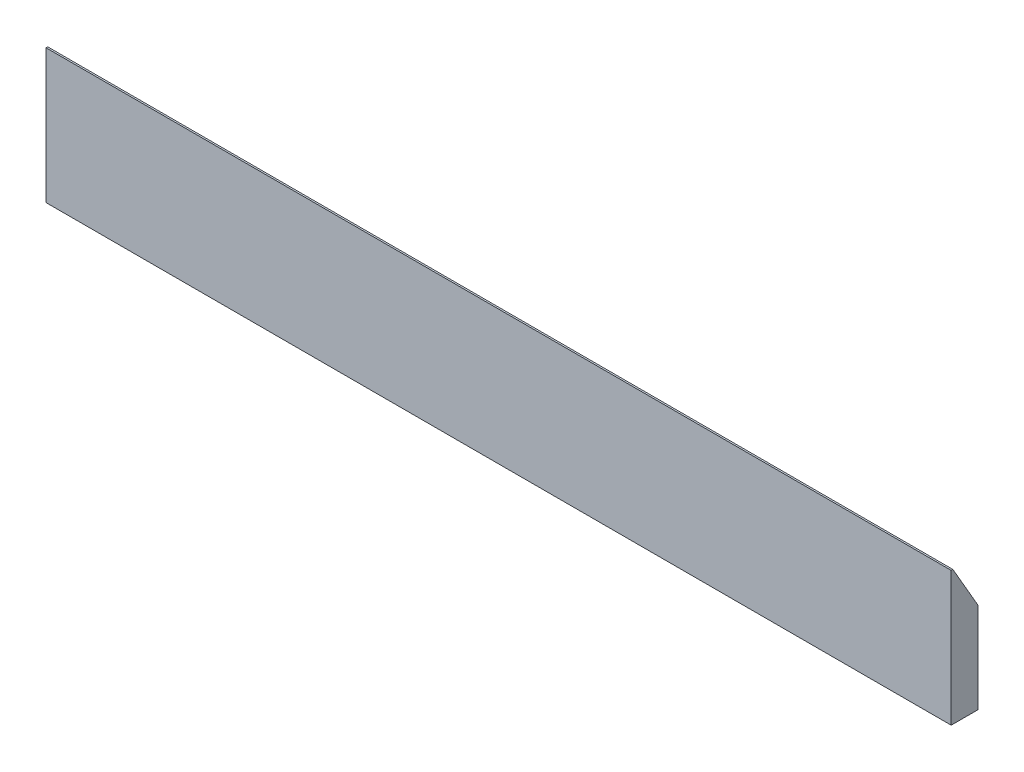
ISO-10303-21;
HEADER;
FILE_DESCRIPTION(('STEP AP214'),'2;1');
FILE_NAME('part.step','',(''),(''),'','','');
FILE_SCHEMA(('AUTOMOTIVE_DESIGN { 1 0 10303 214 1 1 1 1 }'));
ENDSEC;
DATA;
#1=APPLICATION_CONTEXT('core data for automotive mechanical design processes');
#2=APPLICATION_PROTOCOL_DEFINITION('international standard','automotive_design',2000,#1);
#3=PRODUCT_CONTEXT('',#1,'mechanical');
#4=PRODUCT('Part','Part','',(#3));
#5=PRODUCT_RELATED_PRODUCT_CATEGORY('part','',(#4));
#6=PRODUCT_DEFINITION_FORMATION('','',#4);
#7=PRODUCT_DEFINITION_CONTEXT('part definition',#1,'design');
#8=PRODUCT_DEFINITION('design','',#6,#7);
#9=PRODUCT_DEFINITION_SHAPE('','',#8);
#10=(LENGTH_UNIT() NAMED_UNIT(*) SI_UNIT(.MILLI.,.METRE.));
#11=(NAMED_UNIT(*) PLANE_ANGLE_UNIT() SI_UNIT($,.RADIAN.));
#12=(NAMED_UNIT(*) SI_UNIT($,.STERADIAN.) SOLID_ANGLE_UNIT());
#13=UNCERTAINTY_MEASURE_WITH_UNIT(LENGTH_MEASURE(1.E-05),#10,'distance_accuracy_value','');
#14=(GEOMETRIC_REPRESENTATION_CONTEXT(3) GLOBAL_UNCERTAINTY_ASSIGNED_CONTEXT((#13)) GLOBAL_UNIT_ASSIGNED_CONTEXT((#10,
#11,#12)) REPRESENTATION_CONTEXT('',''));
#15=CARTESIAN_POINT('',(0.,0.,0.));
#16=DIRECTION('',(0.,0.,1.));
#17=DIRECTION('',(1.,0.,0.));
#18=AXIS2_PLACEMENT_3D('',#15,#16,#17);
#19=CARTESIAN_POINT('',(0.,0.,0.));
#20=DIRECTION('',(0.,0.,-1.));
#21=DIRECTION('',(-1.,0.,0.));
#22=AXIS2_PLACEMENT_3D('',#19,#20,#21);
#23=PLANE('',#22);
#24=DIRECTION('',(0.,-1.,0.));
#25=VECTOR('',#24,1.);
#26=CARTESIAN_POINT('',(-27.,-4.,0.));
#27=LINE('',#26,#25);
#28=CARTESIAN_POINT('',(-27.,3.48038475772933,0.));
#29=VERTEX_POINT('',#28);
#30=CARTESIAN_POINT('',(-27.,-2.,0.));
#31=VERTEX_POINT('',#30);
#32=EDGE_CURVE('E104',#29,#31,#27,.T.);
#33=ORIENTED_EDGE('',*,*,#32,.F.);
#34=DIRECTION('',(-1.,0.,0.));
#35=VECTOR('',#34,1.);
#36=CARTESIAN_POINT('',(0.,3.48038475772933,0.));
#37=LINE('',#36,#35);
#38=CARTESIAN_POINT('',(24.,3.48038475772933,0.));
#39=VERTEX_POINT('',#38);
#40=EDGE_CURVE('E43',#29,#39,#37,.F.);
#41=ORIENTED_EDGE('',*,*,#40,.T.);
#42=DIRECTION('',(0.,1.,0.));
#43=VECTOR('',#42,1.);
#44=CARTESIAN_POINT('',(24.,-4.,0.));
#45=LINE('',#44,#43);
#46=CARTESIAN_POINT('',(24.,-2.,0.));
#47=VERTEX_POINT('',#46);
#48=EDGE_CURVE('E127',#47,#39,#45,.T.);
#49=ORIENTED_EDGE('',*,*,#48,.F.);
#50=DIRECTION('',(-1.,0.,0.));
#51=VECTOR('',#50,1.);
#52=CARTESIAN_POINT('',(0.,-2.,0.));
#53=LINE('',#52,#51);
#54=EDGE_CURVE('E125',#47,#31,#53,.T.);
#55=ORIENTED_EDGE('',*,*,#54,.T.);
#56=EDGE_LOOP('',(#33,#41,#49,#55));
#57=FACE_BOUND('',#56,.T.);
#58=ADVANCED_FACE('F34',(#57),#23,.T.);
#59=CARTESIAN_POINT('',(24.,-4.,-1.2));
#60=DIRECTION('',(1.,0.,0.));
#61=DIRECTION('',(0.,0.,-1.));
#62=AXIS2_PLACEMENT_3D('',#59,#60,#61);
#63=PLANE('',#62);
#64=ORIENTED_EDGE('',*,*,#48,.T.);
#65=DIRECTION('',(0.,0.866025403784438,0.500000000000001));
#66=VECTOR('',#65,1.);
#67=CARTESIAN_POINT('',(24.,1.40192378864669,-1.2));
#68=LINE('',#67,#66);
#69=CARTESIAN_POINT('',(24.,1.40192378864669,-1.2));
#70=VERTEX_POINT('',#69);
#71=EDGE_CURVE('E11',#39,#70,#68,.F.);
#72=ORIENTED_EDGE('',*,*,#71,.T.);
#73=DIRECTION('',(0.,1.,0.));
#74=VECTOR('',#73,1.);
#75=CARTESIAN_POINT('',(24.,-4.,-1.2));
#76=LINE('',#75,#74);
#77=CARTESIAN_POINT('',(24.,-2.,-1.2));
#78=VERTEX_POINT('',#77);
#79=EDGE_CURVE('E131',#78,#70,#76,.T.);
#80=ORIENTED_EDGE('',*,*,#79,.F.);
#81=DIRECTION('',(0.,0.,-1.));
#82=VECTOR('',#81,1.);
#83=CARTESIAN_POINT('',(24.,-2.,-1.2));
#84=LINE('',#83,#82);
#85=EDGE_CURVE('E118',#47,#78,#84,.T.);
#86=ORIENTED_EDGE('',*,*,#85,.F.);
#87=EDGE_LOOP('',(#64,#72,#80,#86));
#88=FACE_BOUND('',#87,.T.);
#89=ADVANCED_FACE('F171',(#88),#63,.F.);
#90=CARTESIAN_POINT('',(27.,-4.,0.4));
#91=DIRECTION('',(-1.,0.,0.));
#92=DIRECTION('',(0.,0.,1.));
#93=AXIS2_PLACEMENT_3D('',#90,#91,#92);
#94=PLANE('',#93);
#95=DIRECTION('',(0.,-1.,0.));
#96=VECTOR('',#95,1.);
#97=CARTESIAN_POINT('',(27.,-4.,-1.2));
#98=LINE('',#97,#96);
#99=CARTESIAN_POINT('',(27.,1.40192378864669,-1.2));
#100=VERTEX_POINT('',#99);
#101=CARTESIAN_POINT('',(27.,-4.,-1.2));
#102=VERTEX_POINT('',#101);
#103=EDGE_CURVE('E128',#100,#102,#98,.T.);
#104=ORIENTED_EDGE('',*,*,#103,.F.);
#105=DIRECTION('',(0.,-0.866025403784438,-0.500000000000001));
#106=VECTOR('',#105,1.);
#107=CARTESIAN_POINT('',(27.,1.40192378864669,-1.2));
#108=LINE('',#107,#106);
#109=CARTESIAN_POINT('',(27.,4.,0.300000000000005));
#110=VERTEX_POINT('',#109);
#111=EDGE_CURVE('E156',#100,#110,#108,.F.);
#112=ORIENTED_EDGE('',*,*,#111,.T.);
#113=DIRECTION('',(0.,0.,-1.));
#114=VECTOR('',#113,1.);
#115=CARTESIAN_POINT('',(27.,4.,0.4));
#116=LINE('',#115,#114);
#117=CARTESIAN_POINT('',(27.,4.,0.4));
#118=VERTEX_POINT('',#117);
#119=EDGE_CURVE('E150',#118,#110,#116,.T.);
#120=ORIENTED_EDGE('',*,*,#119,.F.);
#121=DIRECTION('',(0.,1.,0.));
#122=VECTOR('',#121,1.);
#123=CARTESIAN_POINT('',(27.,-4.,0.4));
#124=LINE('',#123,#122);
#125=CARTESIAN_POINT('',(27.,-4.,0.4));
#126=VERTEX_POINT('',#125);
#127=EDGE_CURVE('E134',#126,#118,#124,.T.);
#128=ORIENTED_EDGE('',*,*,#127,.F.);
#129=DIRECTION('',(0.,0.,-1.));
#130=VECTOR('',#129,1.);
#131=CARTESIAN_POINT('',(27.,-4.,0.4));
#132=LINE('',#131,#130);
#133=EDGE_CURVE('E142',#126,#102,#132,.T.);
#134=ORIENTED_EDGE('',*,*,#133,.T.);
#135=EDGE_LOOP('',(#104,#112,#120,#128,#134));
#136=FACE_BOUND('',#135,.T.);
#137=ADVANCED_FACE('F174',(#136),#94,.F.);
#138=CARTESIAN_POINT('',(-27.,4.,0.4));
#139=DIRECTION('',(0.,-1.,0.));
#140=DIRECTION('',(0.,0.,-1.));
#141=AXIS2_PLACEMENT_3D('',#138,#139,#140);
#142=PLANE('',#141);
#143=ORIENTED_EDGE('',*,*,#119,.T.);
#144=DIRECTION('',(-1.,0.,0.));
#145=VECTOR('',#144,1.);
#146=CARTESIAN_POINT('',(-27.,4.,0.300000000000005));
#147=LINE('',#146,#145);
#148=CARTESIAN_POINT('',(-27.,4.,0.300000000000005));
#149=VERTEX_POINT('',#148);
#150=EDGE_CURVE('E158',#110,#149,#147,.T.);
#151=ORIENTED_EDGE('',*,*,#150,.T.);
#152=DIRECTION('',(0.,0.,-1.));
#153=VECTOR('',#152,1.);
#154=CARTESIAN_POINT('',(-27.,4.,0.4));
#155=LINE('',#154,#153);
#156=CARTESIAN_POINT('',(-27.,4.,0.4));
#157=VERTEX_POINT('',#156);
#158=EDGE_CURVE('E148',#157,#149,#155,.T.);
#159=ORIENTED_EDGE('',*,*,#158,.F.);
#160=DIRECTION('',(-1.,0.,0.));
#161=VECTOR('',#160,1.);
#162=CARTESIAN_POINT('',(-27.,4.,0.4));
#163=LINE('',#162,#161);
#164=EDGE_CURVE('E136',#118,#157,#163,.T.);
#165=ORIENTED_EDGE('',*,*,#164,.F.);
#166=EDGE_LOOP('',(#143,#151,#159,#165));
#167=FACE_BOUND('',#166,.T.);
#168=ADVANCED_FACE('F163',(#167),#142,.F.);
#169=CARTESIAN_POINT('',(-27.,-4.,0.4));
#170=DIRECTION('',(1.,0.,0.));
#171=DIRECTION('',(0.,0.,-1.));
#172=AXIS2_PLACEMENT_3D('',#169,#170,#171);
#173=PLANE('',#172);
#174=ORIENTED_EDGE('',*,*,#158,.T.);
#175=DIRECTION('',(0.,0.866025403784438,0.500000000000001));
#176=VECTOR('',#175,1.);
#177=CARTESIAN_POINT('',(-27.,1.40192378864669,-1.2));
#178=LINE('',#177,#176);
#179=EDGE_CURVE('E57',#149,#29,#178,.F.);
#180=ORIENTED_EDGE('',*,*,#179,.T.);
#181=ORIENTED_EDGE('',*,*,#32,.T.);
#182=DIRECTION('',(0.,0.,-1.));
#183=VECTOR('',#182,1.);
#184=CARTESIAN_POINT('',(-27.,-2.,0.4));
#185=LINE('',#184,#183);
#186=CARTESIAN_POINT('',(-27.,-2.,-1.2));
#187=VERTEX_POINT('',#186);
#188=EDGE_CURVE('E99',#31,#187,#185,.T.);
#189=ORIENTED_EDGE('',*,*,#188,.T.);
#190=DIRECTION('',(0.,-1.,0.));
#191=VECTOR('',#190,1.);
#192=CARTESIAN_POINT('',(-27.,-2.,-1.2));
#193=LINE('',#192,#191);
#194=CARTESIAN_POINT('',(-27.,-4.,-1.2));
#195=VERTEX_POINT('',#194);
#196=EDGE_CURVE('E103',#187,#195,#193,.T.);
#197=ORIENTED_EDGE('',*,*,#196,.T.);
#198=DIRECTION('',(0.,0.,-1.));
#199=VECTOR('',#198,1.);
#200=CARTESIAN_POINT('',(-27.,-4.,0.4));
#201=LINE('',#200,#199);
#202=CARTESIAN_POINT('',(-27.,-4.,0.4));
#203=VERTEX_POINT('',#202);
#204=EDGE_CURVE('E146',#203,#195,#201,.T.);
#205=ORIENTED_EDGE('',*,*,#204,.F.);
#206=DIRECTION('',(0.,-1.,0.));
#207=VECTOR('',#206,1.);
#208=CARTESIAN_POINT('',(-27.,-4.,0.4));
#209=LINE('',#208,#207);
#210=EDGE_CURVE('E138',#157,#203,#209,.T.);
#211=ORIENTED_EDGE('',*,*,#210,.F.);
#212=EDGE_LOOP('',(#174,#180,#181,#189,#197,#205,#211));
#213=FACE_BOUND('',#212,.T.);
#214=ADVANCED_FACE('F101',(#213),#173,.F.);
#215=CARTESIAN_POINT('',(-27.,-4.,0.4));
#216=DIRECTION('',(0.,1.,0.));
#217=DIRECTION('',(0.,0.,1.));
#218=AXIS2_PLACEMENT_3D('',#215,#216,#217);
#219=PLANE('',#218);
#220=ORIENTED_EDGE('',*,*,#204,.T.);
#221=DIRECTION('',(-1.,0.,0.));
#222=VECTOR('',#221,1.);
#223=CARTESIAN_POINT('',(27.,-4.,-1.2));
#224=LINE('',#223,#222);
#225=EDGE_CURVE('E117',#102,#195,#224,.T.);
#226=ORIENTED_EDGE('',*,*,#225,.F.);
#227=ORIENTED_EDGE('',*,*,#133,.F.);
#228=DIRECTION('',(1.,0.,0.));
#229=VECTOR('',#228,1.);
#230=CARTESIAN_POINT('',(-27.,-4.,0.4));
#231=LINE('',#230,#229);
#232=EDGE_CURVE('E140',#203,#126,#231,.T.);
#233=ORIENTED_EDGE('',*,*,#232,.F.);
#234=EDGE_LOOP('',(#220,#226,#227,#233));
#235=FACE_BOUND('',#234,.T.);
#236=ADVANCED_FACE('F179',(#235),#219,.F.);
#237=CARTESIAN_POINT('',(0.,0.,0.4));
#238=DIRECTION('',(0.,0.,-1.));
#239=DIRECTION('',(-1.,0.,0.));
#240=AXIS2_PLACEMENT_3D('',#237,#238,#239);
#241=PLANE('',#240);
#242=ORIENTED_EDGE('',*,*,#127,.T.);
#243=ORIENTED_EDGE('',*,*,#164,.T.);
#244=ORIENTED_EDGE('',*,*,#210,.T.);
#245=ORIENTED_EDGE('',*,*,#232,.T.);
#246=EDGE_LOOP('',(#242,#243,#244,#245));
#247=FACE_BOUND('',#246,.T.);
#248=ADVANCED_FACE('F181',(#247),#241,.F.);
#249=CARTESIAN_POINT('',(0.,0.,-1.2));
#250=DIRECTION('',(0.,0.,1.));
#251=DIRECTION('',(1.,0.,0.));
#252=AXIS2_PLACEMENT_3D('',#249,#250,#251);
#253=PLANE('',#252);
#254=ORIENTED_EDGE('',*,*,#79,.T.);
#255=DIRECTION('',(1.,0.,0.));
#256=VECTOR('',#255,1.);
#257=CARTESIAN_POINT('',(0.,1.40192378864669,-1.2));
#258=LINE('',#257,#256);
#259=EDGE_CURVE('E153',#70,#100,#258,.T.);
#260=ORIENTED_EDGE('',*,*,#259,.T.);
#261=ORIENTED_EDGE('',*,*,#103,.T.);
#262=ORIENTED_EDGE('',*,*,#225,.T.);
#263=ORIENTED_EDGE('',*,*,#196,.F.);
#264=DIRECTION('',(1.,0.,0.));
#265=VECTOR('',#264,1.);
#266=CARTESIAN_POINT('',(-27.,-2.,-1.2));
#267=LINE('',#266,#265);
#268=EDGE_CURVE('E109',#187,#78,#267,.T.);
#269=ORIENTED_EDGE('',*,*,#268,.T.);
#270=EDGE_LOOP('',(#254,#260,#261,#262,#263,#269));
#271=FACE_BOUND('',#270,.T.);
#272=ADVANCED_FACE('F115',(#271),#253,.F.);
#273=CARTESIAN_POINT('',(0.,-2.,0.));
#274=DIRECTION('',(0.,-1.,0.));
#275=DIRECTION('',(0.,0.,-1.));
#276=AXIS2_PLACEMENT_3D('',#273,#274,#275);
#277=PLANE('',#276);
#278=ORIENTED_EDGE('',*,*,#54,.F.);
#279=ORIENTED_EDGE('',*,*,#85,.T.);
#280=ORIENTED_EDGE('',*,*,#268,.F.);
#281=ORIENTED_EDGE('',*,*,#188,.F.);
#282=EDGE_LOOP('',(#278,#279,#280,#281));
#283=FACE_BOUND('',#282,.T.);
#284=ADVANCED_FACE('F121',(#283),#277,.F.);
#285=CARTESIAN_POINT('',(0.,1.40192378864669,-1.2));
#286=DIRECTION('',(0.,-0.500000000000001,0.866025403784438));
#287=DIRECTION('',(1.,0.,0.));
#288=AXIS2_PLACEMENT_3D('',#285,#286,#287);
#289=PLANE('',#288);
#290=ORIENTED_EDGE('',*,*,#179,.F.);
#291=ORIENTED_EDGE('',*,*,#150,.F.);
#292=ORIENTED_EDGE('',*,*,#111,.F.);
#293=ORIENTED_EDGE('',*,*,#259,.F.);
#294=ORIENTED_EDGE('',*,*,#71,.F.);
#295=ORIENTED_EDGE('',*,*,#40,.F.);
#296=EDGE_LOOP('',(#290,#291,#292,#293,#294,#295));
#297=FACE_BOUND('',#296,.T.);
#298=ADVANCED_FACE('F37',(#297),#289,.F.);
#299=CLOSED_SHELL('',(#58,#89,#137,#168,#214,#236,#248,#272,#284,#298));
#300=MANIFOLD_SOLID_BREP('B2',#299);
#301=ADVANCED_BREP_SHAPE_REPRESENTATION('',(#18,#300),#14);
#302=SHAPE_DEFINITION_REPRESENTATION(#9,#301);
ENDSEC;
END-ISO-10303-21;
